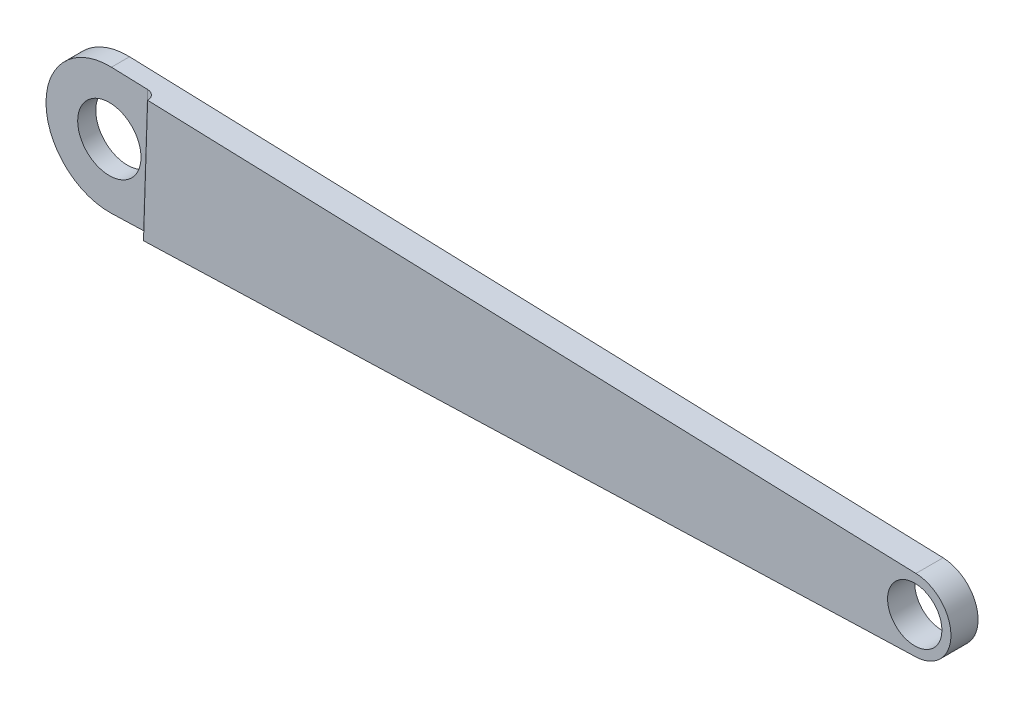
ISO-10303-21;
HEADER;
FILE_DESCRIPTION(('STEP AP214'),'2;1');
FILE_NAME('part.step','',(''),(''),'','','');
FILE_SCHEMA(('AUTOMOTIVE_DESIGN { 1 0 10303 214 1 1 1 1 }'));
ENDSEC;
DATA;
#1=APPLICATION_CONTEXT('core data for automotive mechanical design processes');
#2=APPLICATION_PROTOCOL_DEFINITION('international standard','automotive_design',2000,#1);
#3=PRODUCT_CONTEXT('',#1,'mechanical');
#4=PRODUCT('Part','Part','',(#3));
#5=PRODUCT_RELATED_PRODUCT_CATEGORY('part','',(#4));
#6=PRODUCT_DEFINITION_FORMATION('','',#4);
#7=PRODUCT_DEFINITION_CONTEXT('part definition',#1,'design');
#8=PRODUCT_DEFINITION('design','',#6,#7);
#9=PRODUCT_DEFINITION_SHAPE('','',#8);
#10=(LENGTH_UNIT() NAMED_UNIT(*) SI_UNIT(.MILLI.,.METRE.));
#11=(NAMED_UNIT(*) PLANE_ANGLE_UNIT() SI_UNIT($,.RADIAN.));
#12=(NAMED_UNIT(*) SI_UNIT($,.STERADIAN.) SOLID_ANGLE_UNIT());
#13=UNCERTAINTY_MEASURE_WITH_UNIT(LENGTH_MEASURE(1.E-05),#10,'distance_accuracy_value','');
#14=(GEOMETRIC_REPRESENTATION_CONTEXT(3) GLOBAL_UNCERTAINTY_ASSIGNED_CONTEXT((#13)) GLOBAL_UNIT_ASSIGNED_CONTEXT((#10,
#11,#12)) REPRESENTATION_CONTEXT('',''));
#15=CARTESIAN_POINT('',(0.,0.,0.));
#16=DIRECTION('',(0.,0.,1.));
#17=DIRECTION('',(1.,0.,0.));
#18=AXIS2_PLACEMENT_3D('',#15,#16,#17);
#19=CARTESIAN_POINT('',(-1143.,-4.19931387427627E-13,38.1));
#20=DIRECTION('',(0.,0.,1.));
#21=DIRECTION('',(1.,0.,0.));
#22=AXIS2_PLACEMENT_3D('',#19,#20,#21);
#23=PLANE('',#22);
#24=DIRECTION('',(0.0333333333333332,0.999444290037663,0.));
#25=VECTOR('',#24,1.);
#26=CARTESIAN_POINT('',(-1022.19150387973,-187.759150936734,38.1));
#27=LINE('',#26,#25);
#28=CARTESIAN_POINT('',(-1021.72774793841,-173.854204111165,38.1));
#29=VERTEX_POINT('',#28);
#30=CARTESIAN_POINT('',(-1010.14390849855,173.467861435363,38.1));
#31=VERTEX_POINT('',#30);
#32=EDGE_CURVE('E123',#29,#31,#27,.T.);
#33=ORIENTED_EDGE('',*,*,#32,.F.);
#34=DIRECTION('',(0.999444290037663,0.0333333333333332,0.));
#35=VECTOR('',#34,1.);
#36=CARTESIAN_POINT('',(-1137.07333333333,-177.701194768696,38.1));
#37=LINE('',#36,#35);
#38=CARTESIAN_POINT('',(1146.38666666667,-101.543539867827,38.1));
#39=VERTEX_POINT('',#38);
#40=EDGE_CURVE('E142',#29,#39,#37,.T.);
#41=ORIENTED_EDGE('',*,*,#40,.T.);
#42=CARTESIAN_POINT('',(1143.,0.,38.1));
#43=DIRECTION('',(0.,0.,1.));
#44=DIRECTION('',(1.,0.,0.));
#45=AXIS2_PLACEMENT_3D('',#42,#43,#44);
#46=CIRCLE('',#45,101.6);
#47=CARTESIAN_POINT('',(1146.38666666667,101.543539867827,38.1));
#48=VERTEX_POINT('',#47);
#49=EDGE_CURVE('E113',#39,#48,#46,.T.);
#50=ORIENTED_EDGE('',*,*,#49,.T.);
#51=DIRECTION('',(-0.999444290037663,0.0333333333333332,0.));
#52=VECTOR('',#51,1.);
#53=CARTESIAN_POINT('',(-1137.07333333333,177.701194768696,38.1));
#54=LINE('',#53,#52);
#55=EDGE_CURVE('E108',#48,#31,#54,.T.);
#56=ORIENTED_EDGE('',*,*,#55,.T.);
#57=EDGE_LOOP('',(#33,#41,#50,#56));
#58=FACE_BOUND('',#57,.T.);
#59=CARTESIAN_POINT('',(1143.,0.,38.1));
#60=DIRECTION('',(0.,0.,1.));
#61=DIRECTION('',(1.,0.,0.));
#62=AXIS2_PLACEMENT_3D('',#59,#60,#61);
#63=CIRCLE('',#62,76.2);
#64=CARTESIAN_POINT('',(1066.8,0.,38.1));
#65=VERTEX_POINT('',#64);
#66=EDGE_CURVE('E133',#65,#65,#63,.T.);
#67=ORIENTED_EDGE('',*,*,#66,.F.);
#68=EDGE_LOOP('',(#67));
#69=FACE_BOUND('',#68,.T.);
#70=ADVANCED_FACE('F32',(#58,#69),#23,.T.);
#71=CARTESIAN_POINT('',(-1143.,-4.19931387427627E-13,-38.1));
#72=DIRECTION('',(0.,0.,1.));
#73=DIRECTION('',(1.,0.,0.));
#74=AXIS2_PLACEMENT_3D('',#71,#72,#73);
#75=PLANE('',#74);
#76=CARTESIAN_POINT('',(-1143.,-4.19931387427627E-13,-38.1));
#77=DIRECTION('',(0.,0.,1.));
#78=DIRECTION('',(1.,0.,0.));
#79=AXIS2_PLACEMENT_3D('',#76,#77,#78);
#80=CIRCLE('',#79,177.8);
#81=CARTESIAN_POINT('',(-1137.07333333333,177.701194768696,-38.1));
#82=VERTEX_POINT('',#81);
#83=CARTESIAN_POINT('',(-1137.07333333333,-177.701194768696,-38.1));
#84=VERTEX_POINT('',#83);
#85=EDGE_CURVE('E141',#82,#84,#80,.T.);
#86=ORIENTED_EDGE('',*,*,#85,.F.);
#87=DIRECTION('',(-0.999444290037663,0.0333333333333332,0.));
#88=VECTOR('',#87,1.);
#89=CARTESIAN_POINT('',(-1137.07333333333,177.701194768696,-38.1));
#90=LINE('',#89,#88);
#91=CARTESIAN_POINT('',(1146.38666666667,101.543539867827,-38.1));
#92=VERTEX_POINT('',#91);
#93=EDGE_CURVE('E105',#92,#82,#90,.T.);
#94=ORIENTED_EDGE('',*,*,#93,.F.);
#95=CARTESIAN_POINT('',(1143.,0.,-38.1));
#96=DIRECTION('',(0.,0.,1.));
#97=DIRECTION('',(1.,0.,0.));
#98=AXIS2_PLACEMENT_3D('',#95,#96,#97);
#99=CIRCLE('',#98,101.6);
#100=CARTESIAN_POINT('',(1146.38666666667,-101.543539867827,-38.1));
#101=VERTEX_POINT('',#100);
#102=EDGE_CURVE('E147',#101,#92,#99,.T.);
#103=ORIENTED_EDGE('',*,*,#102,.F.);
#104=DIRECTION('',(0.999444290037663,0.0333333333333332,0.));
#105=VECTOR('',#104,1.);
#106=CARTESIAN_POINT('',(-1137.07333333333,-177.701194768696,-38.1));
#107=LINE('',#106,#105);
#108=EDGE_CURVE('E146',#84,#101,#107,.T.);
#109=ORIENTED_EDGE('',*,*,#108,.F.);
#110=EDGE_LOOP('',(#86,#94,#103,#109));
#111=FACE_BOUND('',#110,.T.);
#112=CARTESIAN_POINT('',(-1143.,-4.19931387427627E-13,-38.1));
#113=DIRECTION('',(0.,0.,1.));
#114=DIRECTION('',(1.,0.,0.));
#115=AXIS2_PLACEMENT_3D('',#112,#113,#114);
#116=CIRCLE('',#115,88.9);
#117=CARTESIAN_POINT('',(-1231.9,-4.19931387427627E-13,-38.1));
#118=VERTEX_POINT('',#117);
#119=EDGE_CURVE('E136',#118,#118,#116,.T.);
#120=ORIENTED_EDGE('',*,*,#119,.T.);
#121=EDGE_LOOP('',(#120));
#122=FACE_BOUND('',#121,.T.);
#123=CARTESIAN_POINT('',(1143.,0.,-38.1));
#124=DIRECTION('',(0.,0.,1.));
#125=DIRECTION('',(1.,0.,0.));
#126=AXIS2_PLACEMENT_3D('',#123,#124,#125);
#127=CIRCLE('',#126,76.2);
#128=CARTESIAN_POINT('',(1066.8,0.,-38.1));
#129=VERTEX_POINT('',#128);
#130=EDGE_CURVE('E132',#129,#129,#127,.T.);
#131=ORIENTED_EDGE('',*,*,#130,.T.);
#132=EDGE_LOOP('',(#131));
#133=FACE_BOUND('',#132,.T.);
#134=ADVANCED_FACE('F154',(#111,#122,#133),#75,.F.);
#135=CARTESIAN_POINT('',(-1143.,-4.19931387427627E-13,38.1));
#136=DIRECTION('',(0.,0.,-1.));
#137=DIRECTION('',(-1.,0.,0.));
#138=AXIS2_PLACEMENT_3D('',#135,#136,#137);
#139=CYLINDRICAL_SURFACE('',#138,177.8);
#140=CARTESIAN_POINT('',(-1143.,-4.19931387427627E-13,12.7));
#141=DIRECTION('',(0.,0.,-1.));
#142=DIRECTION('',(-1.,0.,0.));
#143=AXIS2_PLACEMENT_3D('',#140,#141,#142);
#144=CIRCLE('',#143,177.8);
#145=CARTESIAN_POINT('',(-1137.07333333333,-177.701194768697,12.7));
#146=VERTEX_POINT('',#145);
#147=CARTESIAN_POINT('',(-1137.07333333333,177.701194768696,12.7));
#148=VERTEX_POINT('',#147);
#149=EDGE_CURVE('E84',#146,#148,#144,.T.);
#150=ORIENTED_EDGE('',*,*,#149,.T.);
#151=DIRECTION('',(0.,0.,-1.));
#152=VECTOR('',#151,1.);
#153=CARTESIAN_POINT('',(-1137.07333333333,177.701194768696,38.1));
#154=LINE('',#153,#152);
#155=EDGE_CURVE('E89',#148,#82,#154,.T.);
#156=ORIENTED_EDGE('',*,*,#155,.T.);
#157=ORIENTED_EDGE('',*,*,#85,.T.);
#158=DIRECTION('',(0.,0.,-1.));
#159=VECTOR('',#158,1.);
#160=CARTESIAN_POINT('',(-1137.07333333333,-177.701194768696,38.1));
#161=LINE('',#160,#159);
#162=EDGE_CURVE('E91',#146,#84,#161,.T.);
#163=ORIENTED_EDGE('',*,*,#162,.F.);
#164=EDGE_LOOP('',(#150,#156,#157,#163));
#165=FACE_BOUND('',#164,.T.);
#166=ADVANCED_FACE('F86',(#165),#139,.T.);
#167=CARTESIAN_POINT('',(-1137.07333333333,-177.701194768696,38.1));
#168=DIRECTION('',(-0.0333333333333332,0.999444290037663,0.));
#169=DIRECTION('',(-0.999444290037663,-0.0333333333333332,0.));
#170=AXIS2_PLACEMENT_3D('',#167,#168,#169);
#171=PLANE('',#170);
#172=ORIENTED_EDGE('',*,*,#40,.F.);
#173=CARTESIAN_POINT('',(-1047.17017162467,-174.702756449695,38.1));
#174=DIRECTION('',(-0.0333333333333332,0.999444290037663,0.));
#175=DIRECTION('',(-0.999444290037663,-0.0333333333333332,0.));
#176=AXIS2_PLACEMENT_3D('',#173,#174,#175);
#177=ELLIPSE('',#176,25.456570155902,25.4);
#178=CARTESIAN_POINT('',(-1047.17017162467,-174.702756449695,12.7));
#179=VERTEX_POINT('',#178);
#180=EDGE_CURVE('E11',#29,#179,#177,.T.);
#181=ORIENTED_EDGE('',*,*,#180,.T.);
#182=DIRECTION('',(-0.999444290037663,-0.0333333333333332,0.));
#183=VECTOR('',#182,1.);
#184=CARTESIAN_POINT('',(-1137.07333333333,-177.701194768696,12.7));
#185=LINE('',#184,#183);
#186=EDGE_CURVE('E93',#179,#146,#185,.T.);
#187=ORIENTED_EDGE('',*,*,#186,.T.);
#188=ORIENTED_EDGE('',*,*,#162,.T.);
#189=ORIENTED_EDGE('',*,*,#108,.T.);
#190=DIRECTION('',(0.,0.,-1.));
#191=VECTOR('',#190,1.);
#192=CARTESIAN_POINT('',(1146.38666666667,-101.543539867827,38.1));
#193=LINE('',#192,#191);
#194=EDGE_CURVE('E110',#39,#101,#193,.T.);
#195=ORIENTED_EDGE('',*,*,#194,.F.);
#196=EDGE_LOOP('',(#172,#181,#187,#188,#189,#195));
#197=FACE_BOUND('',#196,.T.);
#198=ADVANCED_FACE('F156',(#197),#171,.F.);
#199=CARTESIAN_POINT('',(1143.,0.,38.1));
#200=DIRECTION('',(0.,0.,-1.));
#201=DIRECTION('',(-1.,0.,0.));
#202=AXIS2_PLACEMENT_3D('',#199,#200,#201);
#203=CYLINDRICAL_SURFACE('',#202,101.6);
#204=ORIENTED_EDGE('',*,*,#102,.T.);
#205=DIRECTION('',(0.,0.,-1.));
#206=VECTOR('',#205,1.);
#207=CARTESIAN_POINT('',(1146.38666666667,101.543539867827,38.1));
#208=LINE('',#207,#206);
#209=EDGE_CURVE('E107',#48,#92,#208,.T.);
#210=ORIENTED_EDGE('',*,*,#209,.F.);
#211=ORIENTED_EDGE('',*,*,#49,.F.);
#212=ORIENTED_EDGE('',*,*,#194,.T.);
#213=EDGE_LOOP('',(#204,#210,#211,#212));
#214=FACE_BOUND('',#213,.T.);
#215=ADVANCED_FACE('F150',(#214),#203,.T.);
#216=CARTESIAN_POINT('',(-1137.07333333333,177.701194768696,38.1));
#217=DIRECTION('',(-0.0333333333333332,-0.999444290037663,0.));
#218=DIRECTION('',(0.999444290037663,-0.0333333333333332,0.));
#219=AXIS2_PLACEMENT_3D('',#216,#217,#218);
#220=PLANE('',#219);
#221=ORIENTED_EDGE('',*,*,#155,.F.);
#222=DIRECTION('',(0.999444290037663,-0.0333333333333332,0.));
#223=VECTOR('',#222,1.);
#224=CARTESIAN_POINT('',(-1137.07333333333,177.701194768696,12.7));
#225=LINE('',#224,#223);
#226=CARTESIAN_POINT('',(-1035.52979346551,174.31452810203,12.7));
#227=VERTEX_POINT('',#226);
#228=EDGE_CURVE('E94',#148,#227,#225,.T.);
#229=ORIENTED_EDGE('',*,*,#228,.T.);
#230=CARTESIAN_POINT('',(-1035.52979346551,174.314528102029,38.1));
#231=DIRECTION('',(-0.0333333333333332,-0.999444290037663,0.));
#232=DIRECTION('',(0.999444290037663,-0.0333333333333332,0.));
#233=AXIS2_PLACEMENT_3D('',#230,#231,#232);
#234=CIRCLE('',#233,25.4);
#235=EDGE_CURVE('E40',#227,#31,#234,.T.);
#236=ORIENTED_EDGE('',*,*,#235,.T.);
#237=ORIENTED_EDGE('',*,*,#55,.F.);
#238=ORIENTED_EDGE('',*,*,#209,.T.);
#239=ORIENTED_EDGE('',*,*,#93,.T.);
#240=EDGE_LOOP('',(#221,#229,#236,#237,#238,#239));
#241=FACE_BOUND('',#240,.T.);
#242=ADVANCED_FACE('F102',(#241),#220,.F.);
#243=CARTESIAN_POINT('',(-1143.,-4.19931387427627E-13,38.1));
#244=DIRECTION('',(0.,0.,-1.));
#245=DIRECTION('',(-1.,0.,0.));
#246=AXIS2_PLACEMENT_3D('',#243,#244,#245);
#247=CYLINDRICAL_SURFACE('',#246,88.9);
#248=CARTESIAN_POINT('',(-1143.,-4.19931387427627E-13,12.7));
#249=DIRECTION('',(0.,0.,-1.));
#250=DIRECTION('',(-1.,0.,0.));
#251=AXIS2_PLACEMENT_3D('',#248,#249,#250);
#252=CIRCLE('',#251,88.9);
#253=CARTESIAN_POINT('',(-1231.9,-4.19931387427627E-13,12.7));
#254=VERTEX_POINT('',#253);
#255=EDGE_CURVE('E100',#254,#254,#252,.T.);
#256=CARTESIAN_POINT('',(-1231.9,-4.19931387427627E-13,12.7));
#257=CARTESIAN_POINT('',(-1231.9,-4.19931387427627E-13,12.1708333333333));
#258=CARTESIAN_POINT('',(-1231.9,-4.19931387427627E-13,11.6416666666667));
#259=CARTESIAN_POINT('',(-1231.9,-4.19931387427627E-13,10.5833333333333));
#260=CARTESIAN_POINT('',(-1231.9,-4.19931387427627E-13,10.0541666666667));
#261=CARTESIAN_POINT('',(-1231.9,-4.19931387427627E-13,8.99583333333334));
#262=CARTESIAN_POINT('',(-1231.9,-4.19931387427627E-13,8.46666666666667));
#263=CARTESIAN_POINT('',(-1231.9,-4.19931387427627E-13,7.40833333333334));
#264=CARTESIAN_POINT('',(-1231.9,-4.19931387427627E-13,6.87916666666667));
#265=CARTESIAN_POINT('',(-1231.9,-4.19931387427627E-13,5.82083333333334));
#266=CARTESIAN_POINT('',(-1231.9,-4.19931387427627E-13,5.29166666666667));
#267=CARTESIAN_POINT('',(-1231.9,-4.19931387427627E-13,4.23333333333334));
#268=CARTESIAN_POINT('',(-1231.9,-4.19931387427627E-13,3.70416666666667));
#269=CARTESIAN_POINT('',(-1231.9,-4.19931387427627E-13,2.64583333333334));
#270=CARTESIAN_POINT('',(-1231.9,-4.19931387427627E-13,2.11666666666667));
#271=CARTESIAN_POINT('',(-1231.9,-4.19931387427627E-13,1.05833333333334));
#272=CARTESIAN_POINT('',(-1231.9,-4.19931387427627E-13,0.529166666666673));
#273=CARTESIAN_POINT('',(-1231.9,-4.19931387427627E-13,-0.529166666666659));
#274=CARTESIAN_POINT('',(-1231.9,-4.19931387427627E-13,-1.05833333333333));
#275=CARTESIAN_POINT('',(-1231.9,-4.19931387427627E-13,-2.11666666666666));
#276=CARTESIAN_POINT('',(-1231.9,-4.19931387427627E-13,-2.64583333333333));
#277=CARTESIAN_POINT('',(-1231.9,-4.19931387427627E-13,-3.70416666666666));
#278=CARTESIAN_POINT('',(-1231.9,-4.19931387427627E-13,-4.23333333333333));
#279=CARTESIAN_POINT('',(-1231.9,-4.19931387427627E-13,-5.29166666666666));
#280=CARTESIAN_POINT('',(-1231.9,-4.19931387427627E-13,-5.82083333333333));
#281=CARTESIAN_POINT('',(-1231.9,-4.19931387427627E-13,-6.87916666666666));
#282=CARTESIAN_POINT('',(-1231.9,-4.19931387427627E-13,-7.40833333333333));
#283=CARTESIAN_POINT('',(-1231.9,-4.19931387427627E-13,-8.46666666666667));
#284=CARTESIAN_POINT('',(-1231.9,-4.19931387427627E-13,-8.99583333333333));
#285=CARTESIAN_POINT('',(-1231.9,-4.19931387427627E-13,-10.0541666666667));
#286=CARTESIAN_POINT('',(-1231.9,-4.19931387427627E-13,-10.5833333333333));
#287=CARTESIAN_POINT('',(-1231.9,-4.19931387427627E-13,-11.6416666666667));
#288=CARTESIAN_POINT('',(-1231.9,-4.19931387427627E-13,-12.1708333333333));
#289=CARTESIAN_POINT('',(-1231.9,-4.19931387427627E-13,-13.2291666666667));
#290=CARTESIAN_POINT('',(-1231.9,-4.19931387427627E-13,-13.7583333333333));
#291=CARTESIAN_POINT('',(-1231.9,-4.19931387427627E-13,-14.8166666666667));
#292=CARTESIAN_POINT('',(-1231.9,-4.19931387427627E-13,-15.3458333333333));
#293=CARTESIAN_POINT('',(-1231.9,-4.19931387427627E-13,-16.4041666666667));
#294=CARTESIAN_POINT('',(-1231.9,-4.19931387427627E-13,-16.9333333333333));
#295=CARTESIAN_POINT('',(-1231.9,-4.19931387427627E-13,-17.9916666666667));
#296=CARTESIAN_POINT('',(-1231.9,-4.19931387427627E-13,-18.5208333333333));
#297=CARTESIAN_POINT('',(-1231.9,-4.19931387427627E-13,-19.5791666666667));
#298=CARTESIAN_POINT('',(-1231.9,-4.19931387427627E-13,-20.1083333333333));
#299=CARTESIAN_POINT('',(-1231.9,-4.19931387427627E-13,-21.1666666666667));
#300=CARTESIAN_POINT('',(-1231.9,-4.19931387427627E-13,-21.6958333333333));
#301=CARTESIAN_POINT('',(-1231.9,-4.19931387427627E-13,-22.7541666666667));
#302=CARTESIAN_POINT('',(-1231.9,-4.19931387427627E-13,-23.2833333333333));
#303=CARTESIAN_POINT('',(-1231.9,-4.19931387427627E-13,-24.3416666666667));
#304=CARTESIAN_POINT('',(-1231.9,-4.19931387427627E-13,-24.8708333333333));
#305=CARTESIAN_POINT('',(-1231.9,-4.19931387427627E-13,-25.9291666666667));
#306=CARTESIAN_POINT('',(-1231.9,-4.19931387427627E-13,-26.4583333333333));
#307=CARTESIAN_POINT('',(-1231.9,-4.19931387427627E-13,-27.5166666666667));
#308=CARTESIAN_POINT('',(-1231.9,-4.19931387427627E-13,-28.0458333333333));
#309=CARTESIAN_POINT('',(-1231.9,-4.19931387427627E-13,-29.1041666666667));
#310=CARTESIAN_POINT('',(-1231.9,-4.19931387427627E-13,-29.6333333333333));
#311=CARTESIAN_POINT('',(-1231.9,-4.19931387427627E-13,-30.6916666666667));
#312=CARTESIAN_POINT('',(-1231.9,-4.19931387427627E-13,-31.2208333333333));
#313=CARTESIAN_POINT('',(-1231.9,-4.19931387427627E-13,-32.2791666666667));
#314=CARTESIAN_POINT('',(-1231.9,-4.19931387427627E-13,-32.8083333333333));
#315=CARTESIAN_POINT('',(-1231.9,-4.19931387427627E-13,-33.8666666666667));
#316=CARTESIAN_POINT('',(-1231.9,-4.19931387427627E-13,-34.3958333333333));
#317=CARTESIAN_POINT('',(-1231.9,-4.19931387427627E-13,-35.4541666666667));
#318=CARTESIAN_POINT('',(-1231.9,-4.19931387427627E-13,-35.9833333333333));
#319=CARTESIAN_POINT('',(-1231.9,-4.19931387427627E-13,-37.0416666666667));
#320=CARTESIAN_POINT('',(-1231.9,-4.19931387427627E-13,-37.5708333333333));
#321=CARTESIAN_POINT('',(-1231.9,-4.19931387427627E-13,-38.1));
#322=B_SPLINE_CURVE_WITH_KNOTS('',3,(#256,#257,#258,#259,#260,#261,#262,#263,#264,#265,#266,
#267,#268,#269,#270,#271,#272,#273,#274,#275,#276,#277,#278,#279,#280,#281,#282,#283,#284,#285,
#286,#287,#288,#289,#290,#291,#292,#293,#294,#295,#296,#297,#298,#299,#300,#301,#302,#303,#304,
#305,#306,#307,#308,#309,#310,#311,#312,#313,#314,#315,#316,#317,#318,#319,#320,#321),
.UNSPECIFIED.,.F.,.F.,(4,2,2,2,2,2,2,2,2,2,2,2,2,2,2,2,2,2,2,2,2,2,2,2,2,2,2,2,2,2,2,2,4),(0.,
1.5875,3.175,4.7625,6.35,7.9375,9.525,11.1125,12.7,14.2875,15.875,17.4625,19.05,20.6375,22.225,
23.8125,25.4,26.9875,28.575,30.1625,31.75,33.3375,34.925,36.5125,38.1,39.6875,41.275,42.8625,
44.45,46.0375,47.625,49.2125,50.8),.UNSPECIFIED.);
#323=EDGE_CURVE('BSEAM171',#254,#118,#322,.T.);
#324=ORIENTED_EDGE('',*,*,#255,.F.);
#325=ORIENTED_EDGE('',*,*,#119,.F.);
#326=ORIENTED_EDGE('',*,*,#323,.T.);
#327=ORIENTED_EDGE('',*,*,#323,.F.);
#328=EDGE_LOOP('',(#324,#326,#325,#327));
#329=FACE_BOUND('',#328,.T.);
#330=ADVANCED_FACE('F171',(#329),#247,.F.);
#331=CARTESIAN_POINT('',(1143.,0.,38.1));
#332=DIRECTION('',(0.,0.,-1.));
#333=DIRECTION('',(-1.,0.,0.));
#334=AXIS2_PLACEMENT_3D('',#331,#332,#333);
#335=CYLINDRICAL_SURFACE('',#334,76.2);
#336=CARTESIAN_POINT('',(1066.8,0.,38.1));
#337=CARTESIAN_POINT('',(1066.8,0.,37.30625));
#338=CARTESIAN_POINT('',(1066.8,0.,36.5125));
#339=CARTESIAN_POINT('',(1066.8,0.,34.925));
#340=CARTESIAN_POINT('',(1066.8,0.,34.13125));
#341=CARTESIAN_POINT('',(1066.8,0.,32.54375));
#342=CARTESIAN_POINT('',(1066.8,0.,31.75));
#343=CARTESIAN_POINT('',(1066.8,0.,30.1625));
#344=CARTESIAN_POINT('',(1066.8,0.,29.36875));
#345=CARTESIAN_POINT('',(1066.8,0.,27.78125));
#346=CARTESIAN_POINT('',(1066.8,0.,26.9875));
#347=CARTESIAN_POINT('',(1066.8,0.,25.4));
#348=CARTESIAN_POINT('',(1066.8,0.,24.60625));
#349=CARTESIAN_POINT('',(1066.8,0.,23.01875));
#350=CARTESIAN_POINT('',(1066.8,0.,22.225));
#351=CARTESIAN_POINT('',(1066.8,0.,20.6375));
#352=CARTESIAN_POINT('',(1066.8,0.,19.84375));
#353=CARTESIAN_POINT('',(1066.8,0.,18.25625));
#354=CARTESIAN_POINT('',(1066.8,0.,17.4625));
#355=CARTESIAN_POINT('',(1066.8,0.,15.875));
#356=CARTESIAN_POINT('',(1066.8,0.,15.08125));
#357=CARTESIAN_POINT('',(1066.8,0.,13.49375));
#358=CARTESIAN_POINT('',(1066.8,0.,12.7));
#359=CARTESIAN_POINT('',(1066.8,0.,11.1125));
#360=CARTESIAN_POINT('',(1066.8,0.,10.31875));
#361=CARTESIAN_POINT('',(1066.8,0.,8.73124999999999));
#362=CARTESIAN_POINT('',(1066.8,0.,7.93749999999999));
#363=CARTESIAN_POINT('',(1066.8,0.,6.35));
#364=CARTESIAN_POINT('',(1066.8,0.,5.55625));
#365=CARTESIAN_POINT('',(1066.8,0.,3.96875));
#366=CARTESIAN_POINT('',(1066.8,0.,3.175));
#367=CARTESIAN_POINT('',(1066.8,0.,1.5875));
#368=CARTESIAN_POINT('',(1066.8,0.,0.793750000000001));
#369=CARTESIAN_POINT('',(1066.8,0.,-0.793750000000001));
#370=CARTESIAN_POINT('',(1066.8,0.,-1.5875));
#371=CARTESIAN_POINT('',(1066.8,0.,-3.175));
#372=CARTESIAN_POINT('',(1066.8,0.,-3.96875));
#373=CARTESIAN_POINT('',(1066.8,0.,-5.55625));
#374=CARTESIAN_POINT('',(1066.8,0.,-6.35));
#375=CARTESIAN_POINT('',(1066.8,0.,-7.93750000000001));
#376=CARTESIAN_POINT('',(1066.8,0.,-8.73125));
#377=CARTESIAN_POINT('',(1066.8,0.,-10.31875));
#378=CARTESIAN_POINT('',(1066.8,0.,-11.1125));
#379=CARTESIAN_POINT('',(1066.8,0.,-12.7));
#380=CARTESIAN_POINT('',(1066.8,0.,-13.49375));
#381=CARTESIAN_POINT('',(1066.8,0.,-15.08125));
#382=CARTESIAN_POINT('',(1066.8,0.,-15.875));
#383=CARTESIAN_POINT('',(1066.8,0.,-17.4625));
#384=CARTESIAN_POINT('',(1066.8,0.,-18.25625));
#385=CARTESIAN_POINT('',(1066.8,0.,-19.84375));
#386=CARTESIAN_POINT('',(1066.8,0.,-20.6375));
#387=CARTESIAN_POINT('',(1066.8,0.,-22.225));
#388=CARTESIAN_POINT('',(1066.8,0.,-23.01875));
#389=CARTESIAN_POINT('',(1066.8,0.,-24.60625));
#390=CARTESIAN_POINT('',(1066.8,0.,-25.4));
#391=CARTESIAN_POINT('',(1066.8,0.,-26.9875));
#392=CARTESIAN_POINT('',(1066.8,0.,-27.78125));
#393=CARTESIAN_POINT('',(1066.8,0.,-29.36875));
#394=CARTESIAN_POINT('',(1066.8,0.,-30.1625));
#395=CARTESIAN_POINT('',(1066.8,0.,-31.75));
#396=CARTESIAN_POINT('',(1066.8,0.,-32.54375));
#397=CARTESIAN_POINT('',(1066.8,0.,-34.13125));
#398=CARTESIAN_POINT('',(1066.8,0.,-34.925));
#399=CARTESIAN_POINT('',(1066.8,0.,-36.5125));
#400=CARTESIAN_POINT('',(1066.8,0.,-37.30625));
#401=CARTESIAN_POINT('',(1066.8,0.,-38.1));
#402=B_SPLINE_CURVE_WITH_KNOTS('',3,(#336,#337,#338,#339,#340,#341,#342,#343,#344,#345,#346,
#347,#348,#349,#350,#351,#352,#353,#354,#355,#356,#357,#358,#359,#360,#361,#362,#363,#364,#365,
#366,#367,#368,#369,#370,#371,#372,#373,#374,#375,#376,#377,#378,#379,#380,#381,#382,#383,#384,
#385,#386,#387,#388,#389,#390,#391,#392,#393,#394,#395,#396,#397,#398,#399,#400,#401),
.UNSPECIFIED.,.F.,.F.,(4,2,2,2,2,2,2,2,2,2,2,2,2,2,2,2,2,2,2,2,2,2,2,2,2,2,2,2,2,2,2,2,4),(0.,
2.38125,4.7625,7.14375,9.52500000000001,11.90625,14.2875,16.66875,19.05,21.43125,23.8125,
26.19375,28.575,30.95625,33.3375,35.71875,38.1,40.48125,42.8625,45.24375,47.625,50.00625,
52.3875,54.76875,57.15,59.53125,61.9125,64.29375,66.675,69.05625,71.4375,73.81875,76.2),.UNSPECIFIED.);
#403=EDGE_CURVE('BSEAM178',#65,#129,#402,.T.);
#404=ORIENTED_EDGE('',*,*,#66,.T.);
#405=ORIENTED_EDGE('',*,*,#130,.F.);
#406=ORIENTED_EDGE('',*,*,#403,.T.);
#407=ORIENTED_EDGE('',*,*,#403,.F.);
#408=EDGE_LOOP('',(#404,#406,#405,#407));
#409=FACE_BOUND('',#408,.T.);
#410=ADVANCED_FACE('F178',(#409),#335,.F.);
#411=CARTESIAN_POINT('',(-1326.82212348321,-177.599150936735,12.7));
#412=DIRECTION('',(0.,0.,-1.));
#413=DIRECTION('',(-1.,0.,0.));
#414=AXIS2_PLACEMENT_3D('',#411,#412,#413);
#415=PLANE('',#414);
#416=ORIENTED_EDGE('',*,*,#255,.T.);
#417=EDGE_LOOP('',(#416));
#418=FACE_BOUND('',#417,.T.);
#419=ORIENTED_EDGE('',*,*,#186,.F.);
#420=DIRECTION('',(0.0333333333333332,0.999444290037663,0.));
#421=VECTOR('',#420,1.);
#422=CARTESIAN_POINT('',(-1035.52979346551,174.314528102029,12.7));
#423=LINE('',#422,#421);
#424=EDGE_CURVE('E98',#179,#227,#423,.T.);
#425=ORIENTED_EDGE('',*,*,#424,.T.);
#426=ORIENTED_EDGE('',*,*,#228,.F.);
#427=ORIENTED_EDGE('',*,*,#149,.F.);
#428=EDGE_LOOP('',(#419,#425,#426,#427));
#429=FACE_BOUND('',#428,.T.);
#430=ADVANCED_FACE('F97',(#418,#429),#415,.F.);
#431=CARTESIAN_POINT('',(-1047.57738884669,-186.912484270068,38.1));
#432=DIRECTION('',(-0.0333333333333332,-0.999444290037663,0.));
#433=DIRECTION('',(0.999444290037663,-0.0333333333333332,0.));
#434=AXIS2_PLACEMENT_3D('',#431,#432,#433);
#435=CYLINDRICAL_SURFACE('',#434,25.4);
#436=ORIENTED_EDGE('',*,*,#180,.F.);
#437=ORIENTED_EDGE('',*,*,#32,.T.);
#438=ORIENTED_EDGE('',*,*,#235,.F.);
#439=ORIENTED_EDGE('',*,*,#424,.F.);
#440=EDGE_LOOP('',(#436,#437,#438,#439));
#441=FACE_BOUND('',#440,.T.);
#442=ADVANCED_FACE('F34',(#441),#435,.F.);
#443=CLOSED_SHELL('',(#70,#134,#166,#198,#215,#242,#330,#410,#430,#442));
#444=MANIFOLD_SOLID_BREP('B2',#443);
#445=ADVANCED_BREP_SHAPE_REPRESENTATION('',(#18,#444),#14);
#446=SHAPE_DEFINITION_REPRESENTATION(#9,#445);
ENDSEC;
END-ISO-10303-21;
